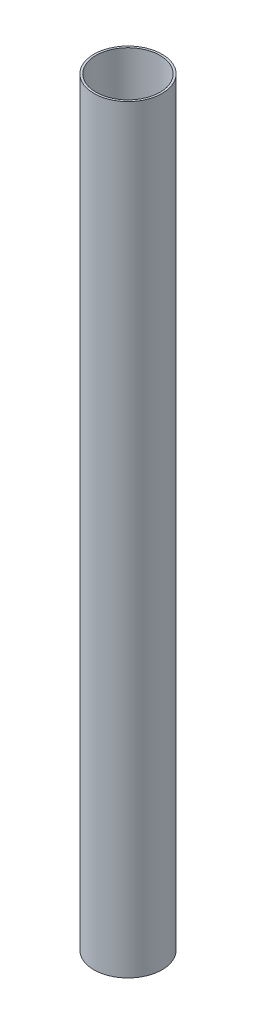
ISO-10303-21;
HEADER;
FILE_DESCRIPTION(('STEP AP214'),'2;1');
FILE_NAME('part.step','',(''),(''),'','','');
FILE_SCHEMA(('AUTOMOTIVE_DESIGN { 1 0 10303 214 1 1 1 1 }'));
ENDSEC;
DATA;
#1=APPLICATION_CONTEXT('core data for automotive mechanical design processes');
#2=APPLICATION_PROTOCOL_DEFINITION('international standard','automotive_design',2000,#1);
#3=PRODUCT_CONTEXT('',#1,'mechanical');
#4=PRODUCT('Part','Part','',(#3));
#5=PRODUCT_RELATED_PRODUCT_CATEGORY('part','',(#4));
#6=PRODUCT_DEFINITION_FORMATION('','',#4);
#7=PRODUCT_DEFINITION_CONTEXT('part definition',#1,'design');
#8=PRODUCT_DEFINITION('design','',#6,#7);
#9=PRODUCT_DEFINITION_SHAPE('','',#8);
#10=(LENGTH_UNIT() NAMED_UNIT(*) SI_UNIT(.MILLI.,.METRE.));
#11=(NAMED_UNIT(*) PLANE_ANGLE_UNIT() SI_UNIT($,.RADIAN.));
#12=(NAMED_UNIT(*) SI_UNIT($,.STERADIAN.) SOLID_ANGLE_UNIT());
#13=UNCERTAINTY_MEASURE_WITH_UNIT(LENGTH_MEASURE(1.E-05),#10,'distance_accuracy_value','');
#14=(GEOMETRIC_REPRESENTATION_CONTEXT(3) GLOBAL_UNCERTAINTY_ASSIGNED_CONTEXT((#13)) GLOBAL_UNIT_ASSIGNED_CONTEXT((#10,
#11,#12)) REPRESENTATION_CONTEXT('',''));
#15=CARTESIAN_POINT('',(0.,0.,0.));
#16=DIRECTION('',(0.,0.,1.));
#17=DIRECTION('',(1.,0.,0.));
#18=AXIS2_PLACEMENT_3D('',#15,#16,#17);
#19=CARTESIAN_POINT('',(0.,495.3,0.));
#20=DIRECTION('',(0.,1.,0.));
#21=DIRECTION('',(0.,0.,1.));
#22=AXIS2_PLACEMENT_3D('',#19,#20,#21);
#23=PLANE('',#22);
#24=CARTESIAN_POINT('',(0.,495.3,0.));
#25=DIRECTION('',(0.,1.,0.));
#26=DIRECTION('',(0.,0.,1.));
#27=AXIS2_PLACEMENT_3D('',#24,#25,#26);
#28=CIRCLE('',#27,22.225);
#29=CARTESIAN_POINT('',(0.,495.3,22.225));
#30=VERTEX_POINT('',#29);
#31=EDGE_CURVE('E11',#30,#30,#28,.T.);
#32=ORIENTED_EDGE('',*,*,#31,.T.);
#33=EDGE_LOOP('',(#32));
#34=FACE_BOUND('',#33,.T.);
#35=CARTESIAN_POINT('',(0.,495.3,0.));
#36=DIRECTION('',(0.,1.,0.));
#37=DIRECTION('',(1.,0.,0.));
#38=AXIS2_PLACEMENT_3D('',#35,#36,#37);
#39=CIRCLE('',#38,20.8788);
#40=CARTESIAN_POINT('',(20.8788,495.3,0.));
#41=VERTEX_POINT('',#40);
#42=EDGE_CURVE('E54',#41,#41,#39,.T.);
#43=ORIENTED_EDGE('',*,*,#42,.F.);
#44=EDGE_LOOP('',(#43));
#45=FACE_BOUND('',#44,.T.);
#46=ADVANCED_FACE('F43',(#34,#45),#23,.T.);
#47=CARTESIAN_POINT('',(0.,0.,0.));
#48=DIRECTION('',(0.,1.,0.));
#49=DIRECTION('',(0.,0.,1.));
#50=AXIS2_PLACEMENT_3D('',#47,#48,#49);
#51=PLANE('',#50);
#52=CARTESIAN_POINT('',(0.,0.,0.));
#53=DIRECTION('',(0.,1.,0.));
#54=DIRECTION('',(0.,0.,1.));
#55=AXIS2_PLACEMENT_3D('',#52,#53,#54);
#56=CIRCLE('',#55,22.225);
#57=CARTESIAN_POINT('',(0.,0.,22.225));
#58=VERTEX_POINT('',#57);
#59=EDGE_CURVE('E47',#58,#58,#56,.T.);
#60=ORIENTED_EDGE('',*,*,#59,.F.);
#61=EDGE_LOOP('',(#60));
#62=FACE_BOUND('',#61,.T.);
#63=CARTESIAN_POINT('',(0.,0.,0.));
#64=DIRECTION('',(0.,1.,0.));
#65=DIRECTION('',(1.,0.,0.));
#66=AXIS2_PLACEMENT_3D('',#63,#64,#65);
#67=CIRCLE('',#66,20.8788);
#68=CARTESIAN_POINT('',(20.8788,0.,0.));
#69=VERTEX_POINT('',#68);
#70=EDGE_CURVE('E56',#69,#69,#67,.T.);
#71=ORIENTED_EDGE('',*,*,#70,.T.);
#72=EDGE_LOOP('',(#71));
#73=FACE_BOUND('',#72,.T.);
#74=ADVANCED_FACE('F66',(#62,#73),#51,.F.);
#75=CARTESIAN_POINT('',(0.,495.3,0.));
#76=DIRECTION('',(0.,-1.,0.));
#77=DIRECTION('',(0.,0.,-1.));
#78=AXIS2_PLACEMENT_3D('',#75,#76,#77);
#79=CYLINDRICAL_SURFACE('',#78,22.225);
#80=ORIENTED_EDGE('',*,*,#31,.F.);
#81=EDGE_LOOP('',(#80));
#82=FACE_BOUND('',#81,.T.);
#83=ORIENTED_EDGE('',*,*,#59,.T.);
#84=EDGE_LOOP('',(#83));
#85=FACE_BOUND('',#84,.T.);
#86=ADVANCED_FACE('F45',(#82,#85),#79,.T.);
#87=CARTESIAN_POINT('',(0.,495.3,0.));
#88=DIRECTION('',(0.,-1.,0.));
#89=DIRECTION('',(0.,0.,-1.));
#90=AXIS2_PLACEMENT_3D('',#87,#88,#89);
#91=CYLINDRICAL_SURFACE('',#90,20.8788);
#92=ORIENTED_EDGE('',*,*,#42,.T.);
#93=EDGE_LOOP('',(#92));
#94=FACE_BOUND('',#93,.T.);
#95=ORIENTED_EDGE('',*,*,#70,.F.);
#96=EDGE_LOOP('',(#95));
#97=FACE_BOUND('',#96,.T.);
#98=ADVANCED_FACE('F62',(#94,#97),#91,.F.);
#99=CLOSED_SHELL('',(#46,#74,#86,#98));
#100=MANIFOLD_SOLID_BREP('B2',#99);
#101=ADVANCED_BREP_SHAPE_REPRESENTATION('',(#18,#100),#14);
#102=SHAPE_DEFINITION_REPRESENTATION(#9,#101);
ENDSEC;
END-ISO-10303-21;
